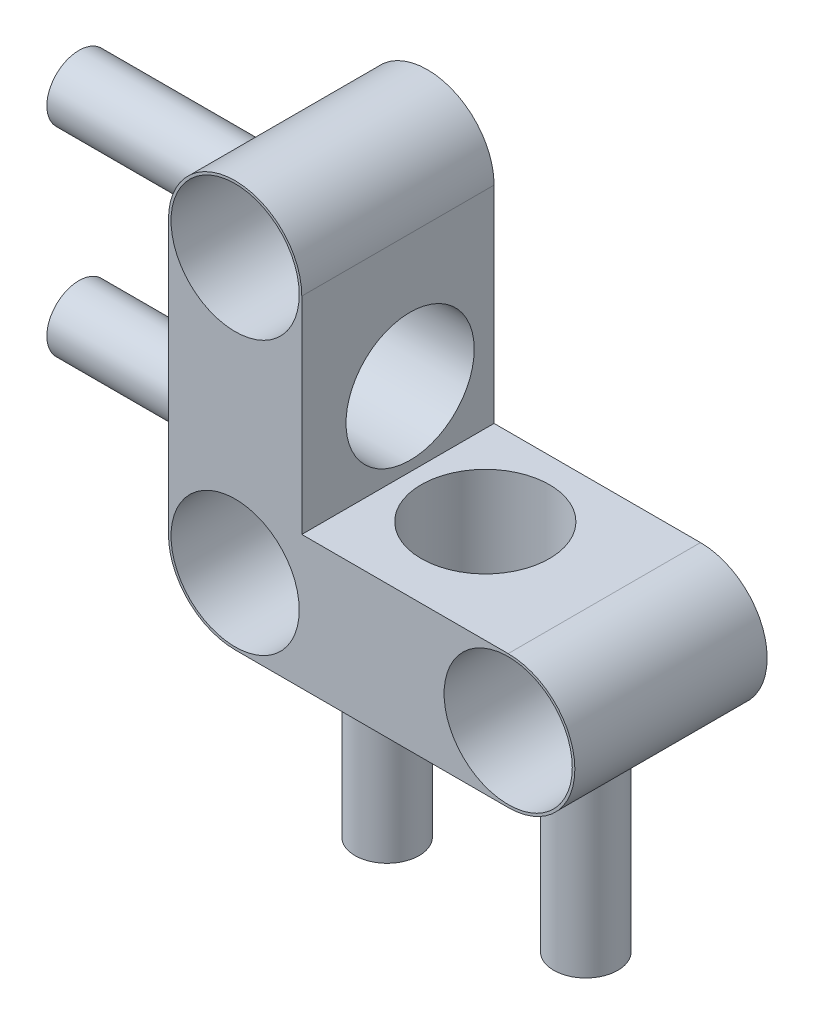
ISO-10303-21;
HEADER;
FILE_DESCRIPTION(('STEP AP214'),'2;1');
FILE_NAME('part.step','',(''),(''),'','','');
FILE_SCHEMA(('AUTOMOTIVE_DESIGN { 1 0 10303 214 1 1 1 1 }'));
ENDSEC;
DATA;
#1=APPLICATION_CONTEXT('core data for automotive mechanical design processes');
#2=APPLICATION_PROTOCOL_DEFINITION('international standard','automotive_design',2000,#1);
#3=PRODUCT_CONTEXT('',#1,'mechanical');
#4=PRODUCT('Part','Part','',(#3));
#5=PRODUCT_RELATED_PRODUCT_CATEGORY('part','',(#4));
#6=PRODUCT_DEFINITION_FORMATION('','',#4);
#7=PRODUCT_DEFINITION_CONTEXT('part definition',#1,'design');
#8=PRODUCT_DEFINITION('design','',#6,#7);
#9=PRODUCT_DEFINITION_SHAPE('','',#8);
#10=(LENGTH_UNIT() NAMED_UNIT(*) SI_UNIT(.MILLI.,.METRE.));
#11=(NAMED_UNIT(*) PLANE_ANGLE_UNIT() SI_UNIT($,.RADIAN.));
#12=(NAMED_UNIT(*) SI_UNIT($,.STERADIAN.) SOLID_ANGLE_UNIT());
#13=UNCERTAINTY_MEASURE_WITH_UNIT(LENGTH_MEASURE(1.E-05),#10,'distance_accuracy_value','');
#14=(GEOMETRIC_REPRESENTATION_CONTEXT(3) GLOBAL_UNCERTAINTY_ASSIGNED_CONTEXT((#13)) GLOBAL_UNIT_ASSIGNED_CONTEXT((#10,
#11,#12)) REPRESENTATION_CONTEXT('',''));
#15=CARTESIAN_POINT('',(0.,0.,0.));
#16=DIRECTION('',(0.,0.,1.));
#17=DIRECTION('',(1.,0.,0.));
#18=AXIS2_PLACEMENT_3D('',#15,#16,#17);
#19=CARTESIAN_POINT('',(2.13,0.,1.5));
#20=DIRECTION('',(0.,0.,-1.));
#21=DIRECTION('',(-1.,0.,0.));
#22=AXIS2_PLACEMENT_3D('',#19,#20,#21);
#23=CYLINDRICAL_SURFACE('',#22,0.5);
#24=CARTESIAN_POINT('',(2.13,0.,0.));
#25=DIRECTION('',(0.,0.,1.));
#26=DIRECTION('',(1.,0.,0.));
#27=AXIS2_PLACEMENT_3D('',#24,#25,#26);
#28=CIRCLE('',#27,0.5);
#29=CARTESIAN_POINT('',(2.63,0.,0.));
#30=VERTEX_POINT('',#29);
#31=EDGE_CURVE('E169',#30,#30,#28,.T.);
#32=ORIENTED_EDGE('',*,*,#31,.F.);
#33=EDGE_LOOP('',(#32));
#34=FACE_BOUND('',#33,.T.);
#35=CARTESIAN_POINT('',(2.13,0.,1.5));
#36=DIRECTION('',(0.,0.,1.));
#37=DIRECTION('',(1.,0.,0.));
#38=AXIS2_PLACEMENT_3D('',#35,#36,#37);
#39=CIRCLE('',#38,0.5);
#40=CARTESIAN_POINT('',(2.63,0.,1.5));
#41=VERTEX_POINT('',#40);
#42=EDGE_CURVE('E142',#41,#41,#39,.T.);
#43=ORIENTED_EDGE('',*,*,#42,.T.);
#44=EDGE_LOOP('',(#43));
#45=FACE_BOUND('',#44,.T.);
#46=CARTESIAN_POINT('',(1.63,0.,0.83527810338155));
#47=CARTESIAN_POINT('',(1.63000010076098,0.00769981438144187,0.835277997822184));
#48=CARTESIAN_POINT('',(1.63017951245112,0.0154012280571269,0.834655429575522));
#49=CARTESIAN_POINT('',(1.63087858802011,0.0305887861575885,0.832175920438017));
#50=CARTESIAN_POINT('',(1.63139836191826,0.0380748601584822,0.830318580414297));
#51=CARTESIAN_POINT('',(1.63272275141394,0.0526182658080319,0.825405418619769));
#52=CARTESIAN_POINT('',(1.63352741857698,0.0596755195693808,0.822349379874426));
#53=CARTESIAN_POINT('',(1.63533385308597,0.0731552795490011,0.815106572574387));
#54=CARTESIAN_POINT('',(1.63633559434965,0.0795778695946826,0.810919953621957));
#55=CARTESIAN_POINT('',(1.63841956329174,0.0915729437150968,0.801544491042354));
#56=CARTESIAN_POINT('',(1.63950133182031,0.0971497909568477,0.796361127715844));
#57=CARTESIAN_POINT('',(1.64163031997641,0.107341668526632,0.785116179940199));
#58=CARTESIAN_POINT('',(1.64267753981022,0.111956704597872,0.779054600735472));
#59=CARTESIAN_POINT('',(1.64461799808904,0.120090767127199,0.76624962826011));
#60=CARTESIAN_POINT('',(1.64551184588736,0.123614177868718,0.75950911036278));
#61=CARTESIAN_POINT('',(1.64705447949288,0.129510465940297,0.745516191780541));
#62=CARTESIAN_POINT('',(1.6477032516179,0.131883279036499,0.738263762543291));
#63=CARTESIAN_POINT('',(1.64868995117908,0.135440384150743,0.723407584088129));
#64=CARTESIAN_POINT('',(1.6490260295623,0.136617609998708,0.715802020813473));
#65=CARTESIAN_POINT('',(1.64934536514542,0.13773695171286,0.700493037228615));
#66=CARTESIAN_POINT('',(1.64932860427073,0.137679004305955,0.692789611925527));
#67=CARTESIAN_POINT('',(1.64894263589627,0.136324266566764,0.677448308266052));
#68=CARTESIAN_POINT('',(1.64857103487485,0.135019063008542,0.669811230703951));
#69=CARTESIAN_POINT('',(1.64751157439857,0.131182484564627,0.654874425378977));
#70=CARTESIAN_POINT('',(1.64682372546373,0.12865115046609,0.647574686403405));
#71=CARTESIAN_POINT('',(1.64520854133787,0.122423475563177,0.633540730877163));
#72=CARTESIAN_POINT('',(1.64428181050807,0.118730069624069,0.626805143211735));
#73=CARTESIAN_POINT('',(1.64229024124896,0.110263444956355,0.614073915883739));
#74=CARTESIAN_POINT('',(1.64122541262285,0.105490302857411,0.608078223756893));
#75=CARTESIAN_POINT('',(1.63908525478939,0.0950310543747071,0.597040656214224));
#76=CARTESIAN_POINT('',(1.63801007911669,0.0893526067160647,0.591991491065472));
#77=CARTESIAN_POINT('',(1.63595929738315,0.0772115238016419,0.582920387424384));
#78=CARTESIAN_POINT('',(1.63498369177057,0.0707488850155875,0.578898453556693));
#79=CARTESIAN_POINT('',(1.63323954076526,0.057230971647493,0.57198283546613));
#80=CARTESIAN_POINT('',(1.63247073719957,0.0501764505527926,0.569087742449927));
#81=CARTESIAN_POINT('',(1.63122061996246,0.0356669429469658,0.564480281232911));
#82=CARTESIAN_POINT('',(1.6307393252383,0.0282119300781006,0.56276799097944));
#83=CARTESIAN_POINT('',(1.63011245662389,0.013053565029301,0.560551041300438));
#84=CARTESIAN_POINT('',(1.62996942145589,0.00534877214220413,0.560055512921043));
#85=CARTESIAN_POINT('',(1.63004157742026,-0.0100389354428494,0.560307735364045));
#86=CARTESIAN_POINT('',(1.63025678027402,-0.0177218494166984,0.56105552686732));
#87=CARTESIAN_POINT('',(1.63102460673413,-0.032885792949424,0.563787260846278));
#88=CARTESIAN_POINT('',(1.63157884093753,-0.0403656797882177,0.56577710472309));
#89=CARTESIAN_POINT('',(1.63296636032831,-0.0548695221105236,0.57095821414397));
#90=CARTESIAN_POINT('',(1.63379962998102,-0.0618935029496159,0.574149412806481));
#91=CARTESIAN_POINT('',(1.63564888878034,-0.0752478970640954,0.581642285007727));
#92=CARTESIAN_POINT('',(1.63666392753177,-0.0815816546003783,0.585938230937016));
#93=CARTESIAN_POINT('',(1.6387671277259,-0.0934154685585464,0.595541173070627));
#94=CARTESIAN_POINT('',(1.63985528495796,-0.0989155729282505,0.600848111087776));
#95=CARTESIAN_POINT('',(1.64197560686849,-0.10889490816589,0.612287327830675));
#96=CARTESIAN_POINT('',(1.643008122047,-0.11338129226703,0.618413304562356));
#97=CARTESIAN_POINT('',(1.6449127607185,-0.12127204768689,0.631348867913452));
#98=CARTESIAN_POINT('',(1.64578487966228,-0.124676388318308,0.638158473913734));
#99=CARTESIAN_POINT('',(1.64727605469293,-0.130331147906899,0.652280499955084));
#100=CARTESIAN_POINT('',(1.64789466813864,-0.132579550229389,0.659593773660964));
#101=CARTESIAN_POINT('',(1.64881112789091,-0.135868352836492,0.674506609330011));
#102=CARTESIAN_POINT('',(1.6491089525957,-0.136908671769702,0.682106190537332));
#103=CARTESIAN_POINT('',(1.64935362283081,-0.137765282886442,0.697441370899619));
#104=CARTESIAN_POINT('',(1.64929761503222,-0.137571624083409,0.705177572854815));
#105=CARTESIAN_POINT('',(1.64883379974338,-0.135940395409902,0.720507110599947));
#106=CARTESIAN_POINT('',(1.64842598909681,-0.134502814379155,0.728100445107475));
#107=CARTESIAN_POINT('',(1.64730077154638,-0.13040683009331,0.742944535865869));
#108=CARTESIAN_POINT('',(1.64658269734183,-0.127745794693362,0.750194516140427));
#109=CARTESIAN_POINT('',(1.64491503267151,-0.121258930493395,0.764124100081125));
#110=CARTESIAN_POINT('',(1.64396546073694,-0.117433194920553,0.770803749344025));
#111=CARTESIAN_POINT('',(1.64194728164259,-0.108739342249674,0.78335531740211));
#112=CARTESIAN_POINT('',(1.64087955724294,-0.103878733999004,0.789232579110056));
#113=CARTESIAN_POINT('',(1.6387379750576,-0.0932258501695129,0.800070696335276));
#114=CARTESIAN_POINT('',(1.63766411708951,-0.087433546742632,0.805031524451131));
#115=CARTESIAN_POINT('',(1.63563487974824,-0.0751122377800212,0.81388197341016));
#116=CARTESIAN_POINT('',(1.63467889135032,-0.0685873834826908,0.817777239390033));
#117=CARTESIAN_POINT('',(1.6329825575751,-0.0549609881514202,0.824439170191297));
#118=CARTESIAN_POINT('',(1.63224215138449,-0.0478596104724976,0.827206153376947));
#119=CARTESIAN_POINT('',(1.63111475102348,-0.0340126143699332,0.831336437606699));
#120=CARTESIAN_POINT('',(1.63069978507899,-0.0273026136655021,0.832812580462754));
#121=CARTESIAN_POINT('',(1.63014235946801,-0.0137288363061471,0.834783479065112));
#122=CARTESIAN_POINT('',(1.62999991016283,-0.00686505381435429,0.8352781974969));
#123=CARTESIAN_POINT('',(1.63,0.,0.83527810338155));
#124=B_SPLINE_CURVE_WITH_KNOTS('',3,(#46,#47,#48,#49,#50,#51,#52,#53,#54,#55,#56,#57,#58,#59,
#60,#61,#62,#63,#64,#65,#66,#67,#68,#69,#70,#71,#72,#73,#74,#75,#76,#77,#78,#79,#80,#81,#82,#83,
#84,#85,#86,#87,#88,#89,#90,#91,#92,#93,#94,#95,#96,#97,#98,#99,#100,#101,#102,#103,#104,#105,
#106,#107,#108,#109,#110,#111,#112,#113,#114,#115,#116,#117,#118,#119,#120,#121,#122,#123),
.UNSPECIFIED.,.T.,.F.,(4,2,2,2,2,2,2,2,2,2,2,2,2,2,2,2,2,2,2,2,2,2,2,2,2,2,2,2,2,2,2,2,2,2,2,2,
2,2,4),(0.,0.0230751298524315,0.0461577222369685,0.0692444946941298,0.0923282137257528,
0.115288466450814,0.138248582070705,0.161115250629174,0.183983195607152,0.206985521901972,
0.22998902651877,0.253148802116266,0.276307807358172,0.299408786720582,0.322508127103718,
0.345421516604601,0.368335009260879,0.391219762396625,0.414106023506119,0.437163514011608,
0.460221758962876,0.483390404039545,0.506557759467274,0.529607342761032,0.552655599847436,
0.575535752727309,0.59841655444206,0.621337139389157,0.644259267701275,0.667366476237006,
0.690473892089113,0.713631255649983,0.736786766091648,0.759779665798919,0.782773252884064,
0.80564255540222,0.828505400483334,0.849078102338266,0.869651586368214),.UNSPECIFIED.);
#125=CARTESIAN_POINT('',(1.63,0.,0.83527810338155));
#126=VERTEX_POINT('',#125);
#127=EDGE_CURVE('E188',#126,#126,#124,.T.);
#128=ORIENTED_EDGE('',*,*,#127,.T.);
#129=EDGE_LOOP('',(#128));
#130=FACE_BOUND('',#129,.T.);
#131=ADVANCED_FACE('F35',(#34,#45,#130),#23,.F.);
#132=CARTESIAN_POINT('',(0.,-0.52,1.5));
#133=DIRECTION('',(0.,1.,0.));
#134=DIRECTION('',(0.,0.,1.));
#135=AXIS2_PLACEMENT_3D('',#132,#133,#134);
#136=PLANE('',#135);
#137=CARTESIAN_POINT('',(0.357721479556611,-0.52,0.672279594325325));
#138=DIRECTION('',(0.,1.,0.));
#139=DIRECTION('',(0.,0.,1.));
#140=AXIS2_PLACEMENT_3D('',#137,#138,#139);
#141=CIRCLE('',#140,0.25);
#142=CARTESIAN_POINT('',(0.357721479556611,-0.52,0.922279594325325));
#143=VERTEX_POINT('',#142);
#144=EDGE_CURVE('E11',#143,#143,#141,.F.);
#145=ORIENTED_EDGE('',*,*,#144,.F.);
#146=EDGE_LOOP('',(#145));
#147=FACE_BOUND('',#146,.T.);
#148=CARTESIAN_POINT('',(1.90772147955661,-0.52,0.672279594325325));
#149=DIRECTION('',(0.,-1.,0.));
#150=DIRECTION('',(0.,0.,-1.));
#151=AXIS2_PLACEMENT_3D('',#148,#149,#150);
#152=CIRCLE('',#151,0.25);
#153=CARTESIAN_POINT('',(2.13,-0.52,0.786701005562464));
#154=VERTEX_POINT('',#153);
#155=CARTESIAN_POINT('',(2.13,-0.52,0.557858183088186));
#156=VERTEX_POINT('',#155);
#157=EDGE_CURVE('E265',#154,#156,#152,.T.);
#158=ORIENTED_EDGE('',*,*,#157,.F.);
#159=DIRECTION('',(0.,0.,-1.));
#160=VECTOR('',#159,1.);
#161=CARTESIAN_POINT('',(2.13,-0.52,1.5));
#162=LINE('',#161,#160);
#163=CARTESIAN_POINT('',(2.13,-0.52,1.5));
#164=VERTEX_POINT('',#163);
#165=EDGE_CURVE('E181',#164,#154,#162,.T.);
#166=ORIENTED_EDGE('',*,*,#165,.F.);
#167=DIRECTION('',(1.,0.,0.));
#168=VECTOR('',#167,1.);
#169=CARTESIAN_POINT('',(0.,-0.52,1.5));
#170=LINE('',#169,#168);
#171=CARTESIAN_POINT('',(0.,-0.52,1.5));
#172=VERTEX_POINT('',#171);
#173=EDGE_CURVE('E172',#172,#164,#170,.T.);
#174=ORIENTED_EDGE('',*,*,#173,.F.);
#175=DIRECTION('',(0.,0.,-1.));
#176=VECTOR('',#175,1.);
#177=CARTESIAN_POINT('',(0.,-0.52,1.5));
#178=LINE('',#177,#176);
#179=CARTESIAN_POINT('',(0.,-0.52,0.));
#180=VERTEX_POINT('',#179);
#181=EDGE_CURVE('E145',#172,#180,#178,.T.);
#182=ORIENTED_EDGE('',*,*,#181,.T.);
#183=DIRECTION('',(1.,0.,0.));
#184=VECTOR('',#183,1.);
#185=CARTESIAN_POINT('',(0.,-0.52,0.));
#186=LINE('',#185,#184);
#187=CARTESIAN_POINT('',(2.13,-0.52,0.));
#188=VERTEX_POINT('',#187);
#189=EDGE_CURVE('E146',#180,#188,#186,.T.);
#190=ORIENTED_EDGE('',*,*,#189,.T.);
#191=EDGE_CURVE('E180',#156,#188,#162,.T.);
#192=ORIENTED_EDGE('',*,*,#191,.F.);
#193=EDGE_LOOP('',(#158,#166,#174,#182,#190,#192));
#194=FACE_BOUND('',#193,.T.);
#195=CARTESIAN_POINT('',(1.14929443724317,-0.52,0.697720253970348));
#196=DIRECTION('',(0.,1.,0.));
#197=DIRECTION('',(0.,0.,1.));
#198=AXIS2_PLACEMENT_3D('',#195,#196,#197);
#199=CIRCLE('',#198,0.5);
#200=CARTESIAN_POINT('',(1.14929443724317,-0.52,1.19772025397035));
#201=VERTEX_POINT('',#200);
#202=EDGE_CURVE('E240',#201,#201,#199,.F.);
#203=ORIENTED_EDGE('',*,*,#202,.F.);
#204=EDGE_LOOP('',(#203));
#205=FACE_BOUND('',#204,.T.);
#206=ADVANCED_FACE('F37',(#147,#194,#205),#136,.F.);
#207=CARTESIAN_POINT('',(2.13,0.,1.5));
#208=DIRECTION('',(0.,0.,-1.));
#209=DIRECTION('',(-1.,0.,0.));
#210=AXIS2_PLACEMENT_3D('',#207,#208,#209);
#211=CYLINDRICAL_SURFACE('',#210,0.52);
#212=CARTESIAN_POINT('',(2.13,0.,0.));
#213=DIRECTION('',(0.,0.,1.));
#214=DIRECTION('',(1.,0.,0.));
#215=AXIS2_PLACEMENT_3D('',#212,#213,#214);
#216=CIRCLE('',#215,0.52);
#217=CARTESIAN_POINT('',(2.13,0.52,0.));
#218=VERTEX_POINT('',#217);
#219=EDGE_CURVE('E149',#188,#218,#216,.T.);
#220=ORIENTED_EDGE('',*,*,#219,.T.);
#221=DIRECTION('',(0.,0.,-1.));
#222=VECTOR('',#221,1.);
#223=CARTESIAN_POINT('',(2.13,0.52,1.5));
#224=LINE('',#223,#222);
#225=CARTESIAN_POINT('',(2.13,0.52,1.5));
#226=VERTEX_POINT('',#225);
#227=EDGE_CURVE('E178',#226,#218,#224,.T.);
#228=ORIENTED_EDGE('',*,*,#227,.F.);
#229=CARTESIAN_POINT('',(2.13,0.,1.5));
#230=DIRECTION('',(0.,0.,1.));
#231=DIRECTION('',(1.,0.,0.));
#232=AXIS2_PLACEMENT_3D('',#229,#230,#231);
#233=CIRCLE('',#232,0.52);
#234=EDGE_CURVE('E97',#164,#226,#233,.T.);
#235=ORIENTED_EDGE('',*,*,#234,.F.);
#236=ORIENTED_EDGE('',*,*,#165,.T.);
#237=EDGE_CURVE('E184',#154,#156,#162,.T.);
#238=ORIENTED_EDGE('',*,*,#237,.T.);
#239=ORIENTED_EDGE('',*,*,#191,.T.);
#240=EDGE_LOOP('',(#220,#228,#235,#236,#238,#239));
#241=FACE_BOUND('',#240,.T.);
#242=ADVANCED_FACE('F227',(#241),#211,.T.);
#243=CARTESIAN_POINT('',(0.,0.52,1.5));
#244=DIRECTION('',(0.,1.,0.));
#245=DIRECTION('',(0.,0.,1.));
#246=AXIS2_PLACEMENT_3D('',#243,#244,#245);
#247=PLANE('',#246);
#248=CARTESIAN_POINT('',(1.14929443724317,0.52,0.697720253970348));
#249=DIRECTION('',(0.,1.,0.));
#250=DIRECTION('',(0.,0.,1.));
#251=AXIS2_PLACEMENT_3D('',#248,#249,#250);
#252=CIRCLE('',#251,0.5);
#253=CARTESIAN_POINT('',(1.14929443724317,0.52,1.19772025397035));
#254=VERTEX_POINT('',#253);
#255=EDGE_CURVE('E195',#254,#254,#252,.F.);
#256=ORIENTED_EDGE('',*,*,#255,.T.);
#257=EDGE_LOOP('',(#256));
#258=FACE_BOUND('',#257,.T.);
#259=DIRECTION('',(1.,0.,0.));
#260=VECTOR('',#259,1.);
#261=CARTESIAN_POINT('',(0.,0.52,0.));
#262=LINE('',#261,#260);
#263=CARTESIAN_POINT('',(0.519999999999992,0.52,0.));
#264=VERTEX_POINT('',#263);
#265=EDGE_CURVE('E153',#264,#218,#262,.T.);
#266=ORIENTED_EDGE('',*,*,#265,.F.);
#267=DIRECTION('',(0.,0.,-1.));
#268=VECTOR('',#267,1.);
#269=CARTESIAN_POINT('',(0.519999999999992,0.52,1.5));
#270=LINE('',#269,#268);
#271=CARTESIAN_POINT('',(0.519999999999992,0.52,1.5));
#272=VERTEX_POINT('',#271);
#273=EDGE_CURVE('E176',#272,#264,#270,.T.);
#274=ORIENTED_EDGE('',*,*,#273,.F.);
#275=DIRECTION('',(1.,0.,0.));
#276=VECTOR('',#275,1.);
#277=CARTESIAN_POINT('',(0.,0.52,1.5));
#278=LINE('',#277,#276);
#279=EDGE_CURVE('E250',#272,#226,#278,.T.);
#280=ORIENTED_EDGE('',*,*,#279,.T.);
#281=ORIENTED_EDGE('',*,*,#227,.T.);
#282=EDGE_LOOP('',(#266,#274,#280,#281));
#283=FACE_BOUND('',#282,.T.);
#284=ADVANCED_FACE('F262',(#258,#283),#247,.T.);
#285=CARTESIAN_POINT('',(0.519999999999992,0.,1.5));
#286=DIRECTION('',(1.,0.,0.));
#287=DIRECTION('',(0.,0.,-1.));
#288=AXIS2_PLACEMENT_3D('',#285,#286,#287);
#289=PLANE('',#288);
#290=CARTESIAN_POINT('',(0.519999999999992,1.09881318365979,0.655033028579055));
#291=DIRECTION('',(1.,0.,0.));
#292=DIRECTION('',(0.,0.,-1.));
#293=AXIS2_PLACEMENT_3D('',#290,#291,#292);
#294=CIRCLE('',#293,0.5);
#295=CARTESIAN_POINT('',(0.519999999999992,1.09881318365979,0.155033028579055));
#296=VERTEX_POINT('',#295);
#297=EDGE_CURVE('E187',#296,#296,#294,.T.);
#298=ORIENTED_EDGE('',*,*,#297,.F.);
#299=EDGE_LOOP('',(#298));
#300=FACE_BOUND('',#299,.T.);
#301=DIRECTION('',(0.,-1.,0.));
#302=VECTOR('',#301,1.);
#303=CARTESIAN_POINT('',(0.519999999999992,0.,0.));
#304=LINE('',#303,#302);
#305=CARTESIAN_POINT('',(0.519999999999992,2.13,0.));
#306=VERTEX_POINT('',#305);
#307=EDGE_CURVE('E156',#306,#264,#304,.T.);
#308=ORIENTED_EDGE('',*,*,#307,.F.);
#309=DIRECTION('',(0.,0.,-1.));
#310=VECTOR('',#309,1.);
#311=CARTESIAN_POINT('',(0.519999999999992,2.13,1.5));
#312=LINE('',#311,#310);
#313=CARTESIAN_POINT('',(0.519999999999992,2.13,1.5));
#314=VERTEX_POINT('',#313);
#315=EDGE_CURVE('E128',#314,#306,#312,.T.);
#316=ORIENTED_EDGE('',*,*,#315,.F.);
#317=DIRECTION('',(0.,-1.,0.));
#318=VECTOR('',#317,1.);
#319=CARTESIAN_POINT('',(0.519999999999992,0.,1.5));
#320=LINE('',#319,#318);
#321=EDGE_CURVE('E118',#314,#272,#320,.T.);
#322=ORIENTED_EDGE('',*,*,#321,.T.);
#323=ORIENTED_EDGE('',*,*,#273,.T.);
#324=EDGE_LOOP('',(#308,#316,#322,#323));
#325=FACE_BOUND('',#324,.T.);
#326=ADVANCED_FACE('F254',(#300,#325),#289,.T.);
#327=CARTESIAN_POINT('',(0.,2.13,1.5));
#328=DIRECTION('',(0.,0.,-1.));
#329=DIRECTION('',(-1.,0.,0.));
#330=AXIS2_PLACEMENT_3D('',#327,#328,#329);
#331=CYLINDRICAL_SURFACE('',#330,0.52);
#332=CARTESIAN_POINT('',(0.,2.13,0.));
#333=DIRECTION('',(0.,0.,1.));
#334=DIRECTION('',(1.,0.,0.));
#335=AXIS2_PLACEMENT_3D('',#332,#333,#334);
#336=CIRCLE('',#335,0.52);
#337=CARTESIAN_POINT('',(-0.520000000000007,2.13,0.));
#338=VERTEX_POINT('',#337);
#339=EDGE_CURVE('E125',#306,#338,#336,.T.);
#340=ORIENTED_EDGE('',*,*,#339,.T.);
#341=DIRECTION('',(0.,0.,-1.));
#342=VECTOR('',#341,1.);
#343=CARTESIAN_POINT('',(-0.520000000000007,2.13,1.5));
#344=LINE('',#343,#342);
#345=CARTESIAN_POINT('',(-0.520000000000007,2.13,1.5));
#346=VERTEX_POINT('',#345);
#347=EDGE_CURVE('E122',#346,#338,#344,.T.);
#348=ORIENTED_EDGE('',*,*,#347,.F.);
#349=CARTESIAN_POINT('',(0.,2.13,1.5));
#350=DIRECTION('',(0.,0.,1.));
#351=DIRECTION('',(1.,0.,0.));
#352=AXIS2_PLACEMENT_3D('',#349,#350,#351);
#353=CIRCLE('',#352,0.52);
#354=EDGE_CURVE('E109',#314,#346,#353,.T.);
#355=ORIENTED_EDGE('',*,*,#354,.F.);
#356=ORIENTED_EDGE('',*,*,#315,.T.);
#357=EDGE_LOOP('',(#340,#348,#355,#356));
#358=FACE_BOUND('',#357,.T.);
#359=ADVANCED_FACE('F123',(#358),#331,.T.);
#360=CARTESIAN_POINT('',(-0.52,0.,1.5));
#361=DIRECTION('',(1.,0.,0.));
#362=DIRECTION('',(0.,1.,0.));
#363=AXIS2_PLACEMENT_3D('',#360,#361,#362);
#364=PLANE('',#363);
#365=CARTESIAN_POINT('',(-0.520000000000001,0.313992931285096,0.698589710835719));
#366=DIRECTION('',(1.,0.,0.));
#367=DIRECTION('',(0.,1.,0.));
#368=AXIS2_PLACEMENT_3D('',#365,#366,#367);
#369=CIRCLE('',#368,0.25);
#370=CARTESIAN_POINT('',(-0.520000000000002,0.563992931285096,0.698589710835719));
#371=VERTEX_POINT('',#370);
#372=EDGE_CURVE('E43',#371,#371,#369,.F.);
#373=ORIENTED_EDGE('',*,*,#372,.F.);
#374=EDGE_LOOP('',(#373));
#375=FACE_BOUND('',#374,.T.);
#376=CARTESIAN_POINT('',(-0.520000000000006,1.86941201582354,0.698589710835719));
#377=DIRECTION('',(1.,0.,0.));
#378=DIRECTION('',(0.,1.,0.));
#379=AXIS2_PLACEMENT_3D('',#376,#377,#378);
#380=CIRCLE('',#379,0.25);
#381=CARTESIAN_POINT('',(-0.520000000000007,2.11941201582354,0.698589710835719));
#382=VERTEX_POINT('',#381);
#383=EDGE_CURVE('E183',#382,#382,#380,.F.);
#384=ORIENTED_EDGE('',*,*,#383,.F.);
#385=EDGE_LOOP('',(#384));
#386=FACE_BOUND('',#385,.T.);
#387=CARTESIAN_POINT('',(-0.520000000000004,1.09881318365979,0.655033028579055));
#388=DIRECTION('',(1.,0.,0.));
#389=DIRECTION('',(0.,1.,0.));
#390=AXIS2_PLACEMENT_3D('',#387,#388,#389);
#391=CIRCLE('',#390,0.5);
#392=CARTESIAN_POINT('',(-0.520000000000005,1.59881318365979,0.655033028579055));
#393=VERTEX_POINT('',#392);
#394=EDGE_CURVE('E150',#393,#393,#391,.T.);
#395=ORIENTED_EDGE('',*,*,#394,.T.);
#396=EDGE_LOOP('',(#395));
#397=FACE_BOUND('',#396,.T.);
#398=DIRECTION('',(0.,-1.,0.));
#399=VECTOR('',#398,1.);
#400=CARTESIAN_POINT('',(-0.52,0.,0.));
#401=LINE('',#400,#399);
#402=CARTESIAN_POINT('',(-0.52,0.,0.));
#403=VERTEX_POINT('',#402);
#404=EDGE_CURVE('E160',#338,#403,#401,.T.);
#405=ORIENTED_EDGE('',*,*,#404,.T.);
#406=DIRECTION('',(0.,0.,-1.));
#407=VECTOR('',#406,1.);
#408=CARTESIAN_POINT('',(-0.52,0.,1.5));
#409=LINE('',#408,#407);
#410=CARTESIAN_POINT('',(-0.52,0.,1.5));
#411=VERTEX_POINT('',#410);
#412=EDGE_CURVE('E129',#411,#403,#409,.T.);
#413=ORIENTED_EDGE('',*,*,#412,.F.);
#414=DIRECTION('',(0.,-1.,0.));
#415=VECTOR('',#414,1.);
#416=CARTESIAN_POINT('',(-0.52,0.,1.5));
#417=LINE('',#416,#415);
#418=EDGE_CURVE('E114',#346,#411,#417,.T.);
#419=ORIENTED_EDGE('',*,*,#418,.F.);
#420=ORIENTED_EDGE('',*,*,#347,.T.);
#421=EDGE_LOOP('',(#405,#413,#419,#420));
#422=FACE_BOUND('',#421,.T.);
#423=ADVANCED_FACE('F131',(#375,#386,#397,#422),#364,.F.);
#424=CARTESIAN_POINT('',(0.,2.13,1.5));
#425=DIRECTION('',(0.,0.,-1.));
#426=DIRECTION('',(-1.,0.,0.));
#427=AXIS2_PLACEMENT_3D('',#424,#425,#426);
#428=CYLINDRICAL_SURFACE('',#427,0.5);
#429=CARTESIAN_POINT('',(0.,2.13,1.5));
#430=DIRECTION('',(0.,0.,1.));
#431=DIRECTION('',(1.,0.,0.));
#432=AXIS2_PLACEMENT_3D('',#429,#430,#431);
#433=CIRCLE('',#432,0.5);
#434=CARTESIAN_POINT('',(0.499999999999993,2.13,1.5));
#435=VERTEX_POINT('',#434);
#436=EDGE_CURVE('E139',#435,#435,#433,.T.);
#437=ORIENTED_EDGE('',*,*,#436,.T.);
#438=EDGE_LOOP('',(#437));
#439=FACE_BOUND('',#438,.T.);
#440=CARTESIAN_POINT('',(0.,2.13,0.));
#441=DIRECTION('',(0.,0.,1.));
#442=DIRECTION('',(1.,0.,0.));
#443=AXIS2_PLACEMENT_3D('',#440,#441,#442);
#444=CIRCLE('',#443,0.5);
#445=CARTESIAN_POINT('',(0.499999999999993,2.13,0.));
#446=VERTEX_POINT('',#445);
#447=EDGE_CURVE('E166',#446,#446,#444,.T.);
#448=ORIENTED_EDGE('',*,*,#447,.F.);
#449=EDGE_LOOP('',(#448));
#450=FACE_BOUND('',#449,.T.);
#451=ADVANCED_FACE('F294',(#439,#450),#428,.F.);
#452=CARTESIAN_POINT('',(0.,0.,1.5));
#453=DIRECTION('',(0.,0.,-1.));
#454=DIRECTION('',(-1.,0.,0.));
#455=AXIS2_PLACEMENT_3D('',#452,#453,#454);
#456=CYLINDRICAL_SURFACE('',#455,0.5);
#457=CARTESIAN_POINT('',(0.,0.,1.5));
#458=DIRECTION('',(0.,0.,1.));
#459=DIRECTION('',(1.,0.,0.));
#460=AXIS2_PLACEMENT_3D('',#457,#458,#459);
#461=CIRCLE('',#460,0.5);
#462=CARTESIAN_POINT('',(0.5,0.,1.5));
#463=VERTEX_POINT('',#462);
#464=EDGE_CURVE('E133',#463,#463,#461,.T.);
#465=ORIENTED_EDGE('',*,*,#464,.T.);
#466=EDGE_LOOP('',(#465));
#467=FACE_BOUND('',#466,.T.);
#468=CARTESIAN_POINT('',(0.,0.,0.));
#469=DIRECTION('',(0.,0.,1.));
#470=DIRECTION('',(1.,0.,0.));
#471=AXIS2_PLACEMENT_3D('',#468,#469,#470);
#472=CIRCLE('',#471,0.5);
#473=CARTESIAN_POINT('',(0.5,0.,0.));
#474=VERTEX_POINT('',#473);
#475=EDGE_CURVE('E163',#474,#474,#472,.T.);
#476=ORIENTED_EDGE('',*,*,#475,.F.);
#477=EDGE_LOOP('',(#476));
#478=FACE_BOUND('',#477,.T.);
#479=ADVANCED_FACE('F304',(#467,#478),#456,.F.);
#480=CARTESIAN_POINT('',(0.,0.,1.5));
#481=DIRECTION('',(0.,0.,-1.));
#482=DIRECTION('',(-1.,0.,0.));
#483=AXIS2_PLACEMENT_3D('',#480,#481,#482);
#484=CYLINDRICAL_SURFACE('',#483,0.52);
#485=CARTESIAN_POINT('',(0.,0.,0.));
#486=DIRECTION('',(0.,0.,1.));
#487=DIRECTION('',(1.,0.,0.));
#488=AXIS2_PLACEMENT_3D('',#485,#486,#487);
#489=CIRCLE('',#488,0.52);
#490=EDGE_CURVE('E88',#403,#180,#489,.T.);
#491=ORIENTED_EDGE('',*,*,#490,.T.);
#492=ORIENTED_EDGE('',*,*,#181,.F.);
#493=CARTESIAN_POINT('',(0.,0.,1.5));
#494=DIRECTION('',(0.,0.,1.));
#495=DIRECTION('',(1.,0.,0.));
#496=AXIS2_PLACEMENT_3D('',#493,#494,#495);
#497=CIRCLE('',#496,0.52);
#498=EDGE_CURVE('E58',#411,#172,#497,.T.);
#499=ORIENTED_EDGE('',*,*,#498,.F.);
#500=ORIENTED_EDGE('',*,*,#412,.T.);
#501=EDGE_LOOP('',(#491,#492,#499,#500));
#502=FACE_BOUND('',#501,.T.);
#503=ADVANCED_FACE('F214',(#502),#484,.T.);
#504=CARTESIAN_POINT('',(0.,0.,1.5));
#505=DIRECTION('',(0.,0.,1.));
#506=DIRECTION('',(1.,0.,0.));
#507=AXIS2_PLACEMENT_3D('',#504,#505,#506);
#508=PLANE('',#507);
#509=ORIENTED_EDGE('',*,*,#173,.T.);
#510=ORIENTED_EDGE('',*,*,#234,.T.);
#511=ORIENTED_EDGE('',*,*,#279,.F.);
#512=ORIENTED_EDGE('',*,*,#321,.F.);
#513=ORIENTED_EDGE('',*,*,#354,.T.);
#514=ORIENTED_EDGE('',*,*,#418,.T.);
#515=ORIENTED_EDGE('',*,*,#498,.T.);
#516=EDGE_LOOP('',(#509,#510,#511,#512,#513,#514,#515));
#517=FACE_BOUND('',#516,.T.);
#518=ORIENTED_EDGE('',*,*,#464,.F.);
#519=EDGE_LOOP('',(#518));
#520=FACE_BOUND('',#519,.T.);
#521=ORIENTED_EDGE('',*,*,#436,.F.);
#522=EDGE_LOOP('',(#521));
#523=FACE_BOUND('',#522,.T.);
#524=ORIENTED_EDGE('',*,*,#42,.F.);
#525=EDGE_LOOP('',(#524));
#526=FACE_BOUND('',#525,.T.);
#527=ADVANCED_FACE('F111',(#517,#520,#523,#526),#508,.T.);
#528=CARTESIAN_POINT('',(0.,0.,0.));
#529=DIRECTION('',(0.,0.,1.));
#530=DIRECTION('',(1.,0.,0.));
#531=AXIS2_PLACEMENT_3D('',#528,#529,#530);
#532=PLANE('',#531);
#533=ORIENTED_EDGE('',*,*,#189,.F.);
#534=ORIENTED_EDGE('',*,*,#490,.F.);
#535=ORIENTED_EDGE('',*,*,#404,.F.);
#536=ORIENTED_EDGE('',*,*,#339,.F.);
#537=ORIENTED_EDGE('',*,*,#307,.T.);
#538=ORIENTED_EDGE('',*,*,#265,.T.);
#539=ORIENTED_EDGE('',*,*,#219,.F.);
#540=EDGE_LOOP('',(#533,#534,#535,#536,#537,#538,#539));
#541=FACE_BOUND('',#540,.T.);
#542=ORIENTED_EDGE('',*,*,#475,.T.);
#543=EDGE_LOOP('',(#542));
#544=FACE_BOUND('',#543,.T.);
#545=ORIENTED_EDGE('',*,*,#447,.T.);
#546=EDGE_LOOP('',(#545));
#547=FACE_BOUND('',#546,.T.);
#548=ORIENTED_EDGE('',*,*,#31,.T.);
#549=EDGE_LOOP('',(#548));
#550=FACE_BOUND('',#549,.T.);
#551=ADVANCED_FACE('F211',(#541,#544,#547,#550),#532,.F.);
#552=CARTESIAN_POINT('',(-1.48000000000001,1.09881318365979,0.655033028579055));
#553=DIRECTION('',(1.,0.,0.));
#554=DIRECTION('',(0.,0.,-1.));
#555=AXIS2_PLACEMENT_3D('',#552,#553,#554);
#556=CYLINDRICAL_SURFACE('',#555,0.5);
#557=ORIENTED_EDGE('',*,*,#297,.T.);
#558=EDGE_LOOP('',(#557));
#559=FACE_BOUND('',#558,.T.);
#560=ORIENTED_EDGE('',*,*,#394,.F.);
#561=EDGE_LOOP('',(#560));
#562=FACE_BOUND('',#561,.T.);
#563=ADVANCED_FACE('F206',(#559,#562),#556,.F.);
#564=CARTESIAN_POINT('',(1.14929443724317,4.,0.697720253970348));
#565=DIRECTION('',(0.,-1.,0.));
#566=DIRECTION('',(0.,0.,-1.));
#567=AXIS2_PLACEMENT_3D('',#564,#565,#566);
#568=CYLINDRICAL_SURFACE('',#567,0.5);
#569=ORIENTED_EDGE('',*,*,#127,.F.);
#570=EDGE_LOOP('',(#569));
#571=FACE_BOUND('',#570,.T.);
#572=ORIENTED_EDGE('',*,*,#255,.F.);
#573=EDGE_LOOP('',(#572));
#574=FACE_BOUND('',#573,.T.);
#575=ORIENTED_EDGE('',*,*,#202,.T.);
#576=EDGE_LOOP('',(#575));
#577=FACE_BOUND('',#576,.T.);
#578=ADVANCED_FACE('F200',(#571,#574,#577),#568,.F.);
#579=CARTESIAN_POINT('',(-2.02000000000001,1.86941201582354,0.698589710835719));
#580=DIRECTION('',(1.,0.,0.));
#581=DIRECTION('',(0.,1.,0.));
#582=AXIS2_PLACEMENT_3D('',#579,#580,#581);
#583=CYLINDRICAL_SURFACE('',#582,0.25);
#584=CARTESIAN_POINT('',(-2.02000000000001,1.86941201582354,0.698589710835719));
#585=DIRECTION('',(-1.,0.,0.));
#586=DIRECTION('',(0.,-1.,0.));
#587=AXIS2_PLACEMENT_3D('',#584,#585,#586);
#588=CIRCLE('',#587,0.25);
#589=CARTESIAN_POINT('',(-2.02000000000001,1.61941201582354,0.698589710835719));
#590=VERTEX_POINT('',#589);
#591=EDGE_CURVE('E196',#590,#590,#588,.T.);
#592=ORIENTED_EDGE('',*,*,#591,.F.);
#593=EDGE_LOOP('',(#592));
#594=FACE_BOUND('',#593,.T.);
#595=ORIENTED_EDGE('',*,*,#383,.T.);
#596=EDGE_LOOP('',(#595));
#597=FACE_BOUND('',#596,.T.);
#598=ADVANCED_FACE('F205',(#594,#597),#583,.T.);
#599=CARTESIAN_POINT('',(-2.02000000000001,1.86941201582354,0.698589710835719));
#600=DIRECTION('',(-1.,0.,0.));
#601=DIRECTION('',(0.,-1.,0.));
#602=AXIS2_PLACEMENT_3D('',#599,#600,#601);
#603=PLANE('',#602);
#604=ORIENTED_EDGE('',*,*,#591,.T.);
#605=EDGE_LOOP('',(#604));
#606=FACE_BOUND('',#605,.T.);
#607=ADVANCED_FACE('F281',(#606),#603,.T.);
#608=CARTESIAN_POINT('',(-2.02,0.313992931285091,0.698589710835719));
#609=DIRECTION('',(1.,0.,0.));
#610=DIRECTION('',(0.,1.,0.));
#611=AXIS2_PLACEMENT_3D('',#608,#609,#610);
#612=CYLINDRICAL_SURFACE('',#611,0.25);
#613=CARTESIAN_POINT('',(-2.02,0.313992931285091,0.698589710835719));
#614=DIRECTION('',(-1.,0.,0.));
#615=DIRECTION('',(0.,-1.,0.));
#616=AXIS2_PLACEMENT_3D('',#613,#614,#615);
#617=CIRCLE('',#616,0.25);
#618=CARTESIAN_POINT('',(-2.02,0.0639929312850907,0.698589710835719));
#619=VERTEX_POINT('',#618);
#620=EDGE_CURVE('E272',#619,#619,#617,.T.);
#621=ORIENTED_EDGE('',*,*,#620,.F.);
#622=EDGE_LOOP('',(#621));
#623=FACE_BOUND('',#622,.T.);
#624=ORIENTED_EDGE('',*,*,#372,.T.);
#625=EDGE_LOOP('',(#624));
#626=FACE_BOUND('',#625,.T.);
#627=ADVANCED_FACE('F291',(#623,#626),#612,.T.);
#628=CARTESIAN_POINT('',(-2.02,0.313992931285091,0.698589710835719));
#629=DIRECTION('',(-1.,0.,0.));
#630=DIRECTION('',(0.,-1.,0.));
#631=AXIS2_PLACEMENT_3D('',#628,#629,#630);
#632=PLANE('',#631);
#633=ORIENTED_EDGE('',*,*,#620,.T.);
#634=EDGE_LOOP('',(#633));
#635=FACE_BOUND('',#634,.T.);
#636=ADVANCED_FACE('F329',(#635),#632,.T.);
#637=CARTESIAN_POINT('',(1.90772147955661,-2.02,0.672279594325325));
#638=DIRECTION('',(0.,1.,0.));
#639=DIRECTION('',(0.,0.,1.));
#640=AXIS2_PLACEMENT_3D('',#637,#638,#639);
#641=CYLINDRICAL_SURFACE('',#640,0.25);
#642=CARTESIAN_POINT('',(1.90772147955661,-2.02,0.672279594325325));
#643=DIRECTION('',(0.,-1.,0.));
#644=DIRECTION('',(0.,0.,-1.));
#645=AXIS2_PLACEMENT_3D('',#642,#643,#644);
#646=CIRCLE('',#645,0.25);
#647=CARTESIAN_POINT('',(1.90772147955661,-2.02,0.422279594325324));
#648=VERTEX_POINT('',#647);
#649=EDGE_CURVE('E269',#648,#648,#646,.T.);
#650=ORIENTED_EDGE('',*,*,#649,.F.);
#651=EDGE_LOOP('',(#650));
#652=FACE_BOUND('',#651,.T.);
#653=EDGE_CURVE('E49',#156,#154,#152,.T.);
#654=ORIENTED_EDGE('',*,*,#653,.T.);
#655=ORIENTED_EDGE('',*,*,#157,.T.);
#656=EDGE_LOOP('',(#654,#655));
#657=FACE_BOUND('',#656,.T.);
#658=ADVANCED_FACE('F268',(#652,#657),#641,.T.);
#659=CARTESIAN_POINT('',(1.90772147955661,-2.02,0.672279594325325));
#660=DIRECTION('',(0.,-1.,0.));
#661=DIRECTION('',(0.,0.,-1.));
#662=AXIS2_PLACEMENT_3D('',#659,#660,#661);
#663=PLANE('',#662);
#664=ORIENTED_EDGE('',*,*,#649,.T.);
#665=EDGE_LOOP('',(#664));
#666=FACE_BOUND('',#665,.T.);
#667=ADVANCED_FACE('F328',(#666),#663,.T.);
#668=CARTESIAN_POINT('',(1.90772147955661,-0.52,0.672279594325325));
#669=DIRECTION('',(0.,-1.,0.));
#670=DIRECTION('',(0.,0.,-1.));
#671=AXIS2_PLACEMENT_3D('',#668,#669,#670);
#672=PLANE('',#671);
#673=ORIENTED_EDGE('',*,*,#237,.F.);
#674=ORIENTED_EDGE('',*,*,#653,.F.);
#675=EDGE_LOOP('',(#673,#674));
#676=FACE_BOUND('',#675,.T.);
#677=ADVANCED_FACE('F266',(#676),#672,.F.);
#678=CARTESIAN_POINT('',(0.357721479556611,-2.02,0.672279594325325));
#679=DIRECTION('',(0.,1.,0.));
#680=DIRECTION('',(0.,0.,1.));
#681=AXIS2_PLACEMENT_3D('',#678,#679,#680);
#682=CYLINDRICAL_SURFACE('',#681,0.25);
#683=CARTESIAN_POINT('',(0.357721479556611,-2.02,0.672279594325325));
#684=DIRECTION('',(0.,-1.,0.));
#685=DIRECTION('',(0.,0.,-1.));
#686=AXIS2_PLACEMENT_3D('',#683,#684,#685);
#687=CIRCLE('',#686,0.25);
#688=CARTESIAN_POINT('',(0.357721479556611,-2.02,0.422279594325325));
#689=VERTEX_POINT('',#688);
#690=EDGE_CURVE('E274',#689,#689,#687,.T.);
#691=ORIENTED_EDGE('',*,*,#690,.F.);
#692=EDGE_LOOP('',(#691));
#693=FACE_BOUND('',#692,.T.);
#694=ORIENTED_EDGE('',*,*,#144,.T.);
#695=EDGE_LOOP('',(#694));
#696=FACE_BOUND('',#695,.T.);
#697=ADVANCED_FACE('F350',(#693,#696),#682,.T.);
#698=CARTESIAN_POINT('',(0.357721479556611,-2.02,0.672279594325325));
#699=DIRECTION('',(0.,-1.,0.));
#700=DIRECTION('',(0.,0.,-1.));
#701=AXIS2_PLACEMENT_3D('',#698,#699,#700);
#702=PLANE('',#701);
#703=ORIENTED_EDGE('',*,*,#690,.T.);
#704=EDGE_LOOP('',(#703));
#705=FACE_BOUND('',#704,.T.);
#706=ADVANCED_FACE('F359',(#705),#702,.T.);
#707=CLOSED_SHELL('',(#131,#206,#242,#284,#326,#359,#423,#451,#479,#503,#527,#551,#563,#578,
#598,#607,#627,#636,#658,#667,#677,#697,#706));
#708=MANIFOLD_SOLID_BREP('B2',#707);
#709=ADVANCED_BREP_SHAPE_REPRESENTATION('',(#18,#708),#14);
#710=SHAPE_DEFINITION_REPRESENTATION(#9,#709);
ENDSEC;
END-ISO-10303-21;
